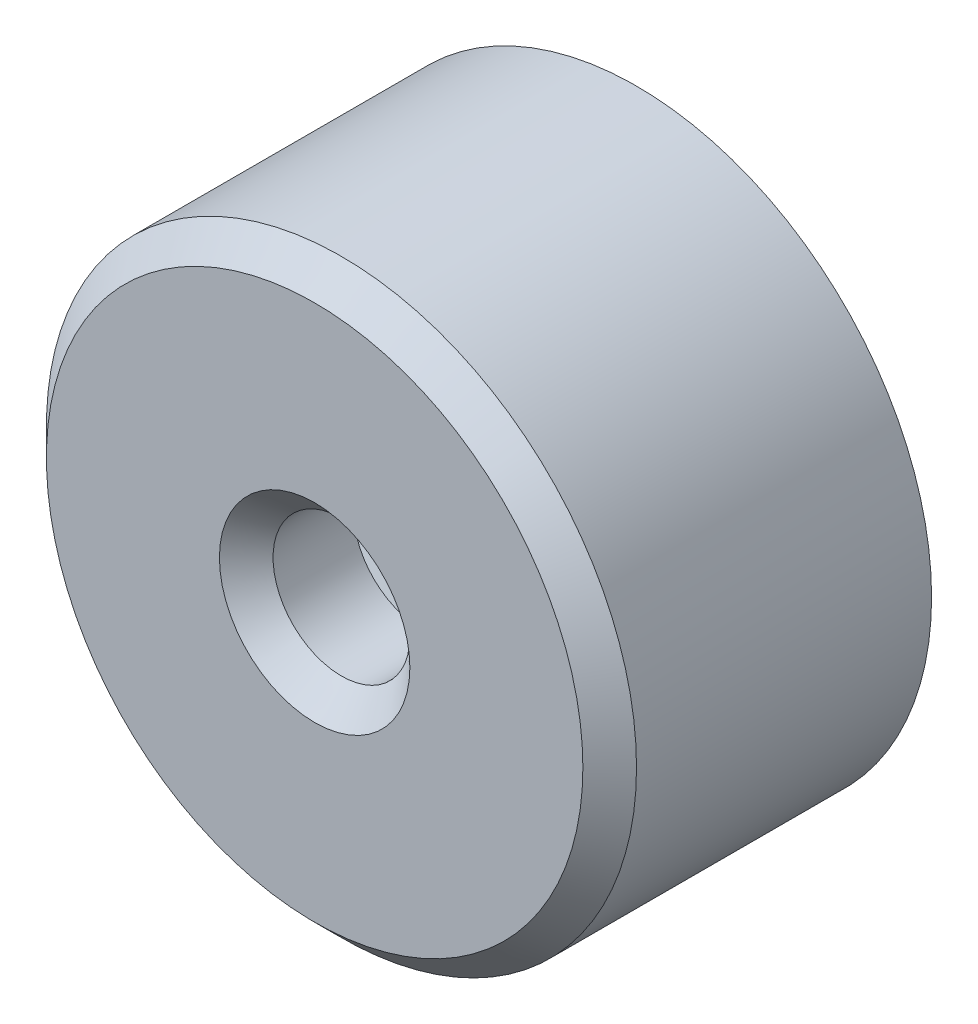
ISO-10303-21;
HEADER;
FILE_DESCRIPTION(('STEP AP214'),'2;1');
FILE_NAME('part.step','',(''),(''),'','','');
FILE_SCHEMA(('AUTOMOTIVE_DESIGN { 1 0 10303 214 1 1 1 1 }'));
ENDSEC;
DATA;
#1=APPLICATION_CONTEXT('core data for automotive mechanical design processes');
#2=APPLICATION_PROTOCOL_DEFINITION('international standard','automotive_design',2000,#1);
#3=PRODUCT_CONTEXT('',#1,'mechanical');
#4=PRODUCT('Part','Part','',(#3));
#5=PRODUCT_RELATED_PRODUCT_CATEGORY('part','',(#4));
#6=PRODUCT_DEFINITION_FORMATION('','',#4);
#7=PRODUCT_DEFINITION_CONTEXT('part definition',#1,'design');
#8=PRODUCT_DEFINITION('design','',#6,#7);
#9=PRODUCT_DEFINITION_SHAPE('','',#8);
#10=(LENGTH_UNIT() NAMED_UNIT(*) SI_UNIT(.MILLI.,.METRE.));
#11=(NAMED_UNIT(*) PLANE_ANGLE_UNIT() SI_UNIT($,.RADIAN.));
#12=(NAMED_UNIT(*) SI_UNIT($,.STERADIAN.) SOLID_ANGLE_UNIT());
#13=UNCERTAINTY_MEASURE_WITH_UNIT(LENGTH_MEASURE(1.E-05),#10,'distance_accuracy_value','');
#14=(GEOMETRIC_REPRESENTATION_CONTEXT(3) GLOBAL_UNCERTAINTY_ASSIGNED_CONTEXT((#13)) GLOBAL_UNIT_ASSIGNED_CONTEXT((#10,
#11,#12)) REPRESENTATION_CONTEXT('',''));
#15=CARTESIAN_POINT('',(0.,0.,0.));
#16=DIRECTION('',(0.,0.,1.));
#17=DIRECTION('',(1.,0.,0.));
#18=AXIS2_PLACEMENT_3D('',#15,#16,#17);
#19=CARTESIAN_POINT('',(0.,0.,0.));
#20=DIRECTION('',(0.,0.,1.));
#21=DIRECTION('',(1.,0.,0.));
#22=AXIS2_PLACEMENT_3D('',#19,#20,#21);
#23=PLANE('',#22);
#24=DIRECTION('',(0.,-1.,0.));
#25=VECTOR('',#24,1.);
#26=CARTESIAN_POINT('',(-5.05,-2.33826859021799,0.));
#27=LINE('',#26,#25);
#28=CARTESIAN_POINT('',(-5.05,2.91561885940762,0.));
#29=VERTEX_POINT('',#28);
#30=CARTESIAN_POINT('',(-5.05,-2.91561885940761,0.));
#31=VERTEX_POINT('',#30);
#32=EDGE_CURVE('E187',#29,#31,#27,.T.);
#33=ORIENTED_EDGE('',*,*,#32,.T.);
#34=DIRECTION('',(0.866025403784438,-0.500000000000001,0.));
#35=VECTOR('',#34,1.);
#36=CARTESIAN_POINT('',(-0.499999999999998,-5.54256258422041,0.));
#37=LINE('',#36,#35);
#38=CARTESIAN_POINT('',(0.,-5.83123771881523,0.));
#39=VERTEX_POINT('',#38);
#40=EDGE_CURVE('E190',#31,#39,#37,.T.);
#41=ORIENTED_EDGE('',*,*,#40,.T.);
#42=DIRECTION('',(0.866025403784439,0.5,0.));
#43=VECTOR('',#42,1.);
#44=CARTESIAN_POINT('',(4.55,-3.20429399400243,0.));
#45=LINE('',#44,#43);
#46=CARTESIAN_POINT('',(5.05,-2.91561885940762,0.));
#47=VERTEX_POINT('',#46);
#48=EDGE_CURVE('E175',#39,#47,#45,.T.);
#49=ORIENTED_EDGE('',*,*,#48,.T.);
#50=DIRECTION('',(0.,1.,0.));
#51=VECTOR('',#50,1.);
#52=CARTESIAN_POINT('',(5.05,2.33826859021798,0.));
#53=LINE('',#52,#51);
#54=CARTESIAN_POINT('',(5.05,2.91561885940761,0.));
#55=VERTEX_POINT('',#54);
#56=EDGE_CURVE('E178',#47,#55,#53,.T.);
#57=ORIENTED_EDGE('',*,*,#56,.T.);
#58=DIRECTION('',(-0.866025403784438,0.5,0.));
#59=VECTOR('',#58,1.);
#60=CARTESIAN_POINT('',(0.499999999999996,5.54256258422041,0.));
#61=LINE('',#60,#59);
#62=CARTESIAN_POINT('',(0.,5.83123771881523,0.));
#63=VERTEX_POINT('',#62);
#64=EDGE_CURVE('E181',#55,#63,#61,.T.);
#65=ORIENTED_EDGE('',*,*,#64,.T.);
#66=DIRECTION('',(-0.866025403784439,-0.5,0.));
#67=VECTOR('',#66,1.);
#68=CARTESIAN_POINT('',(-4.55,3.20429399400244,0.));
#69=LINE('',#68,#67);
#70=EDGE_CURVE('E184',#63,#29,#69,.T.);
#71=ORIENTED_EDGE('',*,*,#70,.T.);
#72=EDGE_LOOP('',(#33,#41,#49,#57,#65,#71));
#73=FACE_BOUND('',#72,.T.);
#74=CARTESIAN_POINT('',(0.,0.,0.));
#75=DIRECTION('',(0.,0.,1.));
#76=DIRECTION('',(1.,0.,0.));
#77=AXIS2_PLACEMENT_3D('',#74,#75,#76);
#78=CIRCLE('',#77,11.);
#79=CARTESIAN_POINT('',(11.,0.,0.));
#80=VERTEX_POINT('',#79);
#81=EDGE_CURVE('E150',#80,#80,#78,.T.);
#82=ORIENTED_EDGE('',*,*,#81,.F.);
#83=EDGE_LOOP('',(#82));
#84=FACE_BOUND('',#83,.T.);
#85=ADVANCED_FACE('F47',(#73,#84),#23,.F.);
#86=CARTESIAN_POINT('',(0.,0.,8.));
#87=DIRECTION('',(0.,0.,-1.));
#88=DIRECTION('',(-1.,0.,0.));
#89=AXIS2_PLACEMENT_3D('',#86,#87,#88);
#90=CYLINDRICAL_SURFACE('',#89,11.);
#91=CARTESIAN_POINT('',(0.,0.,11.));
#92=DIRECTION('',(0.,0.,1.));
#93=DIRECTION('',(1.,0.,0.));
#94=AXIS2_PLACEMENT_3D('',#91,#92,#93);
#95=CIRCLE('',#94,11.);
#96=CARTESIAN_POINT('',(11.,0.,11.));
#97=VERTEX_POINT('',#96);
#98=EDGE_CURVE('E171',#97,#97,#95,.F.);
#99=ORIENTED_EDGE('',*,*,#98,.T.);
#100=EDGE_LOOP('',(#99));
#101=FACE_BOUND('',#100,.T.);
#102=ORIENTED_EDGE('',*,*,#81,.T.);
#103=EDGE_LOOP('',(#102));
#104=FACE_BOUND('',#103,.T.);
#105=ADVANCED_FACE('F293',(#101,#104),#90,.T.);
#106=CARTESIAN_POINT('',(4.05,-2.33826859021799,8.));
#107=DIRECTION('',(-1.,0.,0.));
#108=DIRECTION('',(0.,-1.,0.));
#109=AXIS2_PLACEMENT_3D('',#106,#107,#108);
#110=PLANE('',#109);
#111=DIRECTION('',(0.,0.,-1.));
#112=VECTOR('',#111,1.);
#113=CARTESIAN_POINT('',(4.05,2.33826859021798,8.));
#114=LINE('',#113,#112);
#115=CARTESIAN_POINT('',(4.05,2.33826859021798,8.));
#116=VERTEX_POINT('',#115);
#117=CARTESIAN_POINT('',(4.05,2.33826859021798,1.));
#118=VERTEX_POINT('',#117);
#119=EDGE_CURVE('E138',#116,#118,#114,.T.);
#120=ORIENTED_EDGE('',*,*,#119,.T.);
#121=DIRECTION('',(0.,-1.,0.));
#122=VECTOR('',#121,1.);
#123=CARTESIAN_POINT('',(4.05,-2.33826859021799,1.));
#124=LINE('',#123,#122);
#125=CARTESIAN_POINT('',(4.05,-2.33826859021799,1.));
#126=VERTEX_POINT('',#125);
#127=EDGE_CURVE('E58',#118,#126,#124,.T.);
#128=ORIENTED_EDGE('',*,*,#127,.T.);
#129=DIRECTION('',(0.,0.,-1.));
#130=VECTOR('',#129,1.);
#131=CARTESIAN_POINT('',(4.05,-2.33826859021799,8.));
#132=LINE('',#131,#130);
#133=CARTESIAN_POINT('',(4.05,-2.33826859021799,8.));
#134=VERTEX_POINT('',#133);
#135=EDGE_CURVE('E249',#134,#126,#132,.T.);
#136=ORIENTED_EDGE('',*,*,#135,.F.);
#137=DIRECTION('',(0.,1.,0.));
#138=VECTOR('',#137,1.);
#139=CARTESIAN_POINT('',(4.05,-2.33826859021799,8.));
#140=LINE('',#139,#138);
#141=EDGE_CURVE('E140',#134,#116,#140,.T.);
#142=ORIENTED_EDGE('',*,*,#141,.T.);
#143=EDGE_LOOP('',(#120,#128,#136,#142));
#144=FACE_BOUND('',#143,.T.);
#145=ADVANCED_FACE('F299',(#144),#110,.T.);
#146=CARTESIAN_POINT('',(4.05,2.33826859021798,8.));
#147=DIRECTION('',(-0.5,-0.866025403784439,0.));
#148=DIRECTION('',(0.866025403784438,-0.5,0.));
#149=AXIS2_PLACEMENT_3D('',#146,#147,#148);
#150=PLANE('',#149);
#151=DIRECTION('',(0.,0.,-1.));
#152=VECTOR('',#151,1.);
#153=CARTESIAN_POINT('',(0.,4.67653718043597,8.));
#154=LINE('',#153,#152);
#155=CARTESIAN_POINT('',(0.,4.67653718043597,8.));
#156=VERTEX_POINT('',#155);
#157=CARTESIAN_POINT('',(0.,4.67653718043597,1.));
#158=VERTEX_POINT('',#157);
#159=EDGE_CURVE('E137',#156,#158,#154,.T.);
#160=ORIENTED_EDGE('',*,*,#159,.T.);
#161=DIRECTION('',(0.866025403784438,-0.5,0.));
#162=VECTOR('',#161,1.);
#163=CARTESIAN_POINT('',(4.05,2.33826859021798,1.));
#164=LINE('',#163,#162);
#165=EDGE_CURVE('E73',#158,#118,#164,.T.);
#166=ORIENTED_EDGE('',*,*,#165,.T.);
#167=ORIENTED_EDGE('',*,*,#119,.F.);
#168=DIRECTION('',(-0.866025403784438,0.5,0.));
#169=VECTOR('',#168,1.);
#170=CARTESIAN_POINT('',(4.05,2.33826859021798,8.));
#171=LINE('',#170,#169);
#172=EDGE_CURVE('E126',#116,#156,#171,.T.);
#173=ORIENTED_EDGE('',*,*,#172,.T.);
#174=EDGE_LOOP('',(#160,#166,#167,#173));
#175=FACE_BOUND('',#174,.T.);
#176=ADVANCED_FACE('F136',(#175),#150,.T.);
#177=CARTESIAN_POINT('',(0.,4.67653718043597,8.));
#178=DIRECTION('',(0.5,-0.866025403784439,0.));
#179=DIRECTION('',(0.866025403784439,0.5,0.));
#180=AXIS2_PLACEMENT_3D('',#177,#178,#179);
#181=PLANE('',#180);
#182=DIRECTION('',(0.,0.,-1.));
#183=VECTOR('',#182,1.);
#184=CARTESIAN_POINT('',(-4.05,2.338268590218,8.));
#185=LINE('',#184,#183);
#186=CARTESIAN_POINT('',(-4.05,2.338268590218,8.));
#187=VERTEX_POINT('',#186);
#188=CARTESIAN_POINT('',(-4.05,2.338268590218,1.));
#189=VERTEX_POINT('',#188);
#190=EDGE_CURVE('E146',#187,#189,#185,.T.);
#191=ORIENTED_EDGE('',*,*,#190,.T.);
#192=DIRECTION('',(0.866025403784439,0.5,0.));
#193=VECTOR('',#192,1.);
#194=CARTESIAN_POINT('',(0.,4.67653718043597,1.));
#195=LINE('',#194,#193);
#196=EDGE_CURVE('E144',#189,#158,#195,.T.);
#197=ORIENTED_EDGE('',*,*,#196,.T.);
#198=ORIENTED_EDGE('',*,*,#159,.F.);
#199=DIRECTION('',(-0.866025403784439,-0.5,0.));
#200=VECTOR('',#199,1.);
#201=CARTESIAN_POINT('',(0.,4.67653718043597,8.));
#202=LINE('',#201,#200);
#203=EDGE_CURVE('E122',#156,#187,#202,.T.);
#204=ORIENTED_EDGE('',*,*,#203,.T.);
#205=EDGE_LOOP('',(#191,#197,#198,#204));
#206=FACE_BOUND('',#205,.T.);
#207=ADVANCED_FACE('F142',(#206),#181,.T.);
#208=CARTESIAN_POINT('',(-4.05,2.338268590218,8.));
#209=DIRECTION('',(1.,0.,0.));
#210=DIRECTION('',(0.,0.,-1.));
#211=AXIS2_PLACEMENT_3D('',#208,#209,#210);
#212=PLANE('',#211);
#213=DIRECTION('',(0.,0.,-1.));
#214=VECTOR('',#213,1.);
#215=CARTESIAN_POINT('',(-4.05,-2.33826859021799,8.));
#216=LINE('',#215,#214);
#217=CARTESIAN_POINT('',(-4.05,-2.33826859021799,8.));
#218=VERTEX_POINT('',#217);
#219=CARTESIAN_POINT('',(-4.05,-2.33826859021799,1.));
#220=VERTEX_POINT('',#219);
#221=EDGE_CURVE('E152',#218,#220,#216,.T.);
#222=ORIENTED_EDGE('',*,*,#221,.T.);
#223=DIRECTION('',(0.,1.,0.));
#224=VECTOR('',#223,1.);
#225=CARTESIAN_POINT('',(-4.05,2.338268590218,1.));
#226=LINE('',#225,#224);
#227=EDGE_CURVE('E198',#220,#189,#226,.T.);
#228=ORIENTED_EDGE('',*,*,#227,.T.);
#229=ORIENTED_EDGE('',*,*,#190,.F.);
#230=DIRECTION('',(0.,-1.,0.));
#231=VECTOR('',#230,1.);
#232=CARTESIAN_POINT('',(-4.05,2.338268590218,8.));
#233=LINE('',#232,#231);
#234=EDGE_CURVE('E129',#187,#218,#233,.T.);
#235=ORIENTED_EDGE('',*,*,#234,.T.);
#236=EDGE_LOOP('',(#222,#228,#229,#235));
#237=FACE_BOUND('',#236,.T.);
#238=ADVANCED_FACE('F259',(#237),#212,.T.);
#239=CARTESIAN_POINT('',(-4.05,-2.33826859021799,8.));
#240=DIRECTION('',(0.500000000000001,0.866025403784438,0.));
#241=DIRECTION('',(-0.866025403784438,0.500000000000001,0.));
#242=AXIS2_PLACEMENT_3D('',#239,#240,#241);
#243=PLANE('',#242);
#244=DIRECTION('',(0.,0.,-1.));
#245=VECTOR('',#244,1.);
#246=CARTESIAN_POINT('',(0.,-4.67653718043598,8.));
#247=LINE('',#246,#245);
#248=CARTESIAN_POINT('',(0.,-4.67653718043598,8.));
#249=VERTEX_POINT('',#248);
#250=CARTESIAN_POINT('',(0.,-4.67653718043598,1.));
#251=VERTEX_POINT('',#250);
#252=EDGE_CURVE('E252',#249,#251,#247,.T.);
#253=ORIENTED_EDGE('',*,*,#252,.T.);
#254=DIRECTION('',(-0.866025403784438,0.500000000000001,0.));
#255=VECTOR('',#254,1.);
#256=CARTESIAN_POINT('',(-4.05,-2.33826859021799,1.));
#257=LINE('',#256,#255);
#258=EDGE_CURVE('E194',#251,#220,#257,.T.);
#259=ORIENTED_EDGE('',*,*,#258,.T.);
#260=ORIENTED_EDGE('',*,*,#221,.F.);
#261=DIRECTION('',(0.866025403784438,-0.500000000000001,0.));
#262=VECTOR('',#261,1.);
#263=CARTESIAN_POINT('',(-4.05,-2.33826859021799,8.));
#264=LINE('',#263,#262);
#265=EDGE_CURVE('E241',#218,#249,#264,.T.);
#266=ORIENTED_EDGE('',*,*,#265,.T.);
#267=EDGE_LOOP('',(#253,#259,#260,#266));
#268=FACE_BOUND('',#267,.T.);
#269=ADVANCED_FACE('F262',(#268),#243,.T.);
#270=CARTESIAN_POINT('',(0.,-4.67653718043598,8.));
#271=DIRECTION('',(-0.5,0.866025403784439,0.));
#272=DIRECTION('',(-0.866025403784439,-0.5,0.));
#273=AXIS2_PLACEMENT_3D('',#270,#271,#272);
#274=PLANE('',#273);
#275=ORIENTED_EDGE('',*,*,#135,.T.);
#276=DIRECTION('',(-0.866025403784439,-0.5,0.));
#277=VECTOR('',#276,1.);
#278=CARTESIAN_POINT('',(0.,-4.67653718043598,1.));
#279=LINE('',#278,#277);
#280=EDGE_CURVE('E11',#126,#251,#279,.T.);
#281=ORIENTED_EDGE('',*,*,#280,.T.);
#282=ORIENTED_EDGE('',*,*,#252,.F.);
#283=DIRECTION('',(0.866025403784439,0.5,0.));
#284=VECTOR('',#283,1.);
#285=CARTESIAN_POINT('',(0.,-4.67653718043598,8.));
#286=LINE('',#285,#284);
#287=EDGE_CURVE('E245',#249,#134,#286,.T.);
#288=ORIENTED_EDGE('',*,*,#287,.T.);
#289=EDGE_LOOP('',(#275,#281,#282,#288));
#290=FACE_BOUND('',#289,.T.);
#291=ADVANCED_FACE('F403',(#290),#274,.T.);
#292=CARTESIAN_POINT('',(0.,0.,12.));
#293=DIRECTION('',(0.,0.,1.));
#294=DIRECTION('',(1.,0.,0.));
#295=AXIS2_PLACEMENT_3D('',#292,#293,#294);
#296=PLANE('',#295);
#297=CARTESIAN_POINT('',(0.,0.,12.));
#298=DIRECTION('',(0.,0.,1.));
#299=DIRECTION('',(1.,0.,0.));
#300=AXIS2_PLACEMENT_3D('',#297,#298,#299);
#301=CIRCLE('',#300,3.55);
#302=CARTESIAN_POINT('',(3.55,0.,12.));
#303=VERTEX_POINT('',#302);
#304=EDGE_CURVE('E167',#303,#303,#301,.F.);
#305=ORIENTED_EDGE('',*,*,#304,.T.);
#306=EDGE_LOOP('',(#305));
#307=FACE_BOUND('',#306,.T.);
#308=CARTESIAN_POINT('',(0.,0.,12.));
#309=DIRECTION('',(0.,0.,1.));
#310=DIRECTION('',(1.,0.,0.));
#311=AXIS2_PLACEMENT_3D('',#308,#309,#310);
#312=CIRCLE('',#311,10.);
#313=CARTESIAN_POINT('',(10.,0.,12.));
#314=VERTEX_POINT('',#313);
#315=EDGE_CURVE('E163',#314,#314,#312,.T.);
#316=ORIENTED_EDGE('',*,*,#315,.T.);
#317=EDGE_LOOP('',(#316));
#318=FACE_BOUND('',#317,.T.);
#319=ADVANCED_FACE('F395',(#307,#318),#296,.T.);
#320=CARTESIAN_POINT('',(0.,0.,8.));
#321=DIRECTION('',(0.,0.,1.));
#322=DIRECTION('',(1.,0.,0.));
#323=AXIS2_PLACEMENT_3D('',#320,#321,#322);
#324=PLANE('',#323);
#325=ORIENTED_EDGE('',*,*,#172,.F.);
#326=ORIENTED_EDGE('',*,*,#141,.F.);
#327=ORIENTED_EDGE('',*,*,#287,.F.);
#328=ORIENTED_EDGE('',*,*,#265,.F.);
#329=ORIENTED_EDGE('',*,*,#234,.F.);
#330=ORIENTED_EDGE('',*,*,#203,.F.);
#331=EDGE_LOOP('',(#325,#326,#327,#328,#329,#330));
#332=FACE_BOUND('',#331,.T.);
#333=CARTESIAN_POINT('',(0.,0.,8.));
#334=DIRECTION('',(0.,0.,1.));
#335=DIRECTION('',(1.,0.,0.));
#336=AXIS2_PLACEMENT_3D('',#333,#334,#335);
#337=CIRCLE('',#336,2.55);
#338=CARTESIAN_POINT('',(2.55,0.,8.));
#339=VERTEX_POINT('',#338);
#340=EDGE_CURVE('E228',#339,#339,#337,.T.);
#341=ORIENTED_EDGE('',*,*,#340,.T.);
#342=EDGE_LOOP('',(#341));
#343=FACE_BOUND('',#342,.T.);
#344=ADVANCED_FACE('F124',(#332,#343),#324,.F.);
#345=CARTESIAN_POINT('',(0.,0.,12.));
#346=DIRECTION('',(0.,0.,-1.));
#347=DIRECTION('',(-1.,0.,0.));
#348=AXIS2_PLACEMENT_3D('',#345,#346,#347);
#349=CYLINDRICAL_SURFACE('',#348,2.55);
#350=CARTESIAN_POINT('',(0.,0.,11.));
#351=DIRECTION('',(0.,0.,1.));
#352=DIRECTION('',(1.,0.,0.));
#353=AXIS2_PLACEMENT_3D('',#350,#351,#352);
#354=CIRCLE('',#353,2.55);
#355=CARTESIAN_POINT('',(2.55,0.,11.));
#356=VERTEX_POINT('',#355);
#357=EDGE_CURVE('E159',#356,#356,#354,.T.);
#358=ORIENTED_EDGE('',*,*,#357,.T.);
#359=EDGE_LOOP('',(#358));
#360=FACE_BOUND('',#359,.T.);
#361=ORIENTED_EDGE('',*,*,#340,.F.);
#362=EDGE_LOOP('',(#361));
#363=FACE_BOUND('',#362,.T.);
#364=ADVANCED_FACE('F312',(#360,#363),#349,.F.);
#365=CARTESIAN_POINT('',(0.,0.,11.));
#366=DIRECTION('',(0.,0.,1.));
#367=DIRECTION('',(1.,0.,0.));
#368=AXIS2_PLACEMENT_3D('',#365,#366,#367);
#369=CONICAL_SURFACE('',#368,2.55,0.78539816339745);
#370=ORIENTED_EDGE('',*,*,#304,.F.);
#371=EDGE_LOOP('',(#370));
#372=FACE_BOUND('',#371,.T.);
#373=ORIENTED_EDGE('',*,*,#357,.F.);
#374=EDGE_LOOP('',(#373));
#375=FACE_BOUND('',#374,.T.);
#376=ADVANCED_FACE('F306',(#372,#375),#369,.F.);
#377=CARTESIAN_POINT('',(0.,0.,12.));
#378=DIRECTION('',(0.,0.,-1.));
#379=DIRECTION('',(-1.,0.,0.));
#380=AXIS2_PLACEMENT_3D('',#377,#378,#379);
#381=CONICAL_SURFACE('',#380,10.,0.785398163397447);
#382=ORIENTED_EDGE('',*,*,#98,.F.);
#383=EDGE_LOOP('',(#382));
#384=FACE_BOUND('',#383,.T.);
#385=ORIENTED_EDGE('',*,*,#315,.F.);
#386=EDGE_LOOP('',(#385));
#387=FACE_BOUND('',#386,.T.);
#388=ADVANCED_FACE('F289',(#384,#387),#381,.T.);
#389=CARTESIAN_POINT('',(2.525,4.37342828911142,0.));
#390=DIRECTION('',(-0.353553390593274,-0.612372435695795,-0.707106781186547));
#391=DIRECTION('',(0.866025403784438,-0.5,0.));
#392=AXIS2_PLACEMENT_3D('',#389,#390,#391);
#393=PLANE('',#392);
#394=DIRECTION('',(0.654653670707976,0.377964473009227,-0.654653670707978));
#395=VECTOR('',#394,1.);
#396=CARTESIAN_POINT('',(4.32857142857143,2.49910187949224,0.721428571428571));
#397=LINE('',#396,#395);
#398=EDGE_CURVE('E220',#118,#55,#397,.T.);
#399=ORIENTED_EDGE('',*,*,#398,.F.);
#400=ORIENTED_EDGE('',*,*,#165,.F.);
#401=DIRECTION('',(0.,0.755928946018454,-0.654653670707978));
#402=VECTOR('',#401,1.);
#403=CARTESIAN_POINT('',(0.,4.99820375898448,0.721428571428572));
#404=LINE('',#403,#402);
#405=EDGE_CURVE('E52',#63,#158,#404,.F.);
#406=ORIENTED_EDGE('',*,*,#405,.F.);
#407=ORIENTED_EDGE('',*,*,#64,.F.);
#408=EDGE_LOOP('',(#399,#400,#406,#407));
#409=FACE_BOUND('',#408,.T.);
#410=ADVANCED_FACE('F50',(#409),#393,.T.);
#411=CARTESIAN_POINT('',(-2.525,4.37342828911142,0.));
#412=DIRECTION('',(0.353553390593274,-0.612372435695796,-0.707106781186547));
#413=DIRECTION('',(0.866025403784439,0.5,0.));
#414=AXIS2_PLACEMENT_3D('',#411,#412,#413);
#415=PLANE('',#414);
#416=ORIENTED_EDGE('',*,*,#405,.T.);
#417=ORIENTED_EDGE('',*,*,#196,.F.);
#418=DIRECTION('',(-0.654653670707976,0.377964473009227,-0.654653670707978));
#419=VECTOR('',#418,1.);
#420=CARTESIAN_POINT('',(-4.32857142857142,2.49910187949225,0.721428571428576));
#421=LINE('',#420,#419);
#422=EDGE_CURVE('E217',#29,#189,#421,.F.);
#423=ORIENTED_EDGE('',*,*,#422,.F.);
#424=ORIENTED_EDGE('',*,*,#70,.F.);
#425=EDGE_LOOP('',(#416,#417,#423,#424));
#426=FACE_BOUND('',#425,.T.);
#427=ADVANCED_FACE('F281',(#426),#415,.T.);
#428=CARTESIAN_POINT('',(5.05,0.,0.));
#429=DIRECTION('',(-0.707106781186549,0.,-0.707106781186546));
#430=DIRECTION('',(0.,-1.,0.));
#431=AXIS2_PLACEMENT_3D('',#428,#429,#430);
#432=PLANE('',#431);
#433=ORIENTED_EDGE('',*,*,#398,.T.);
#434=ORIENTED_EDGE('',*,*,#56,.F.);
#435=DIRECTION('',(0.654653670707976,-0.377964473009227,-0.654653670707978));
#436=VECTOR('',#435,1.);
#437=CARTESIAN_POINT('',(4.32857142857143,-2.49910187949225,0.721428571428573));
#438=LINE('',#437,#436);
#439=EDGE_CURVE('E213',#126,#47,#438,.T.);
#440=ORIENTED_EDGE('',*,*,#439,.F.);
#441=ORIENTED_EDGE('',*,*,#127,.F.);
#442=EDGE_LOOP('',(#433,#434,#440,#441));
#443=FACE_BOUND('',#442,.T.);
#444=ADVANCED_FACE('F283',(#443),#432,.T.);
#445=CARTESIAN_POINT('',(-5.05,0.,0.));
#446=DIRECTION('',(0.707106781186549,0.,-0.707106781186546));
#447=DIRECTION('',(0.,1.,0.));
#448=AXIS2_PLACEMENT_3D('',#445,#446,#447);
#449=PLANE('',#448);
#450=ORIENTED_EDGE('',*,*,#422,.T.);
#451=ORIENTED_EDGE('',*,*,#227,.F.);
#452=DIRECTION('',(-0.654653670707976,-0.377964473009226,-0.654653670707979));
#453=VECTOR('',#452,1.);
#454=CARTESIAN_POINT('',(-4.32857142857143,-2.49910187949224,0.721428571428571));
#455=LINE('',#454,#453);
#456=EDGE_CURVE('E210',#31,#220,#455,.F.);
#457=ORIENTED_EDGE('',*,*,#456,.F.);
#458=ORIENTED_EDGE('',*,*,#32,.F.);
#459=EDGE_LOOP('',(#450,#451,#457,#458));
#460=FACE_BOUND('',#459,.T.);
#461=ADVANCED_FACE('F280',(#460),#449,.T.);
#462=CARTESIAN_POINT('',(2.525,-4.37342828911142,0.));
#463=DIRECTION('',(-0.353553390593274,0.612372435695795,-0.707106781186546));
#464=DIRECTION('',(-0.866025403784439,-0.5,0.));
#465=AXIS2_PLACEMENT_3D('',#462,#463,#464);
#466=PLANE('',#465);
#467=ORIENTED_EDGE('',*,*,#439,.T.);
#468=ORIENTED_EDGE('',*,*,#48,.F.);
#469=DIRECTION('',(0.,0.755928946018453,0.654653670707978));
#470=VECTOR('',#469,1.);
#471=CARTESIAN_POINT('',(0.,-4.99820375898448,0.721428571428576));
#472=LINE('',#471,#470);
#473=EDGE_CURVE('E207',#251,#39,#472,.F.);
#474=ORIENTED_EDGE('',*,*,#473,.F.);
#475=ORIENTED_EDGE('',*,*,#280,.F.);
#476=EDGE_LOOP('',(#467,#468,#474,#475));
#477=FACE_BOUND('',#476,.T.);
#478=ADVANCED_FACE('F273',(#477),#466,.T.);
#479=CARTESIAN_POINT('',(-2.525,-4.37342828911142,0.));
#480=DIRECTION('',(0.353553390593275,0.612372435695796,-0.707106781186546));
#481=DIRECTION('',(-0.866025403784438,0.500000000000001,0.));
#482=AXIS2_PLACEMENT_3D('',#479,#480,#481);
#483=PLANE('',#482);
#484=ORIENTED_EDGE('',*,*,#456,.T.);
#485=ORIENTED_EDGE('',*,*,#258,.F.);
#486=ORIENTED_EDGE('',*,*,#473,.T.);
#487=ORIENTED_EDGE('',*,*,#40,.F.);
#488=EDGE_LOOP('',(#484,#485,#486,#487));
#489=FACE_BOUND('',#488,.T.);
#490=ADVANCED_FACE('F267',(#489),#483,.T.);
#491=CLOSED_SHELL('',(#85,#105,#145,#176,#207,#238,#269,#291,#319,#344,#364,#376,#388,#410,#427,
#444,#461,#478,#490));
#492=MANIFOLD_SOLID_BREP('B2',#491);
#493=ADVANCED_BREP_SHAPE_REPRESENTATION('',(#18,#492),#14);
#494=SHAPE_DEFINITION_REPRESENTATION(#9,#493);
ENDSEC;
END-ISO-10303-21;
